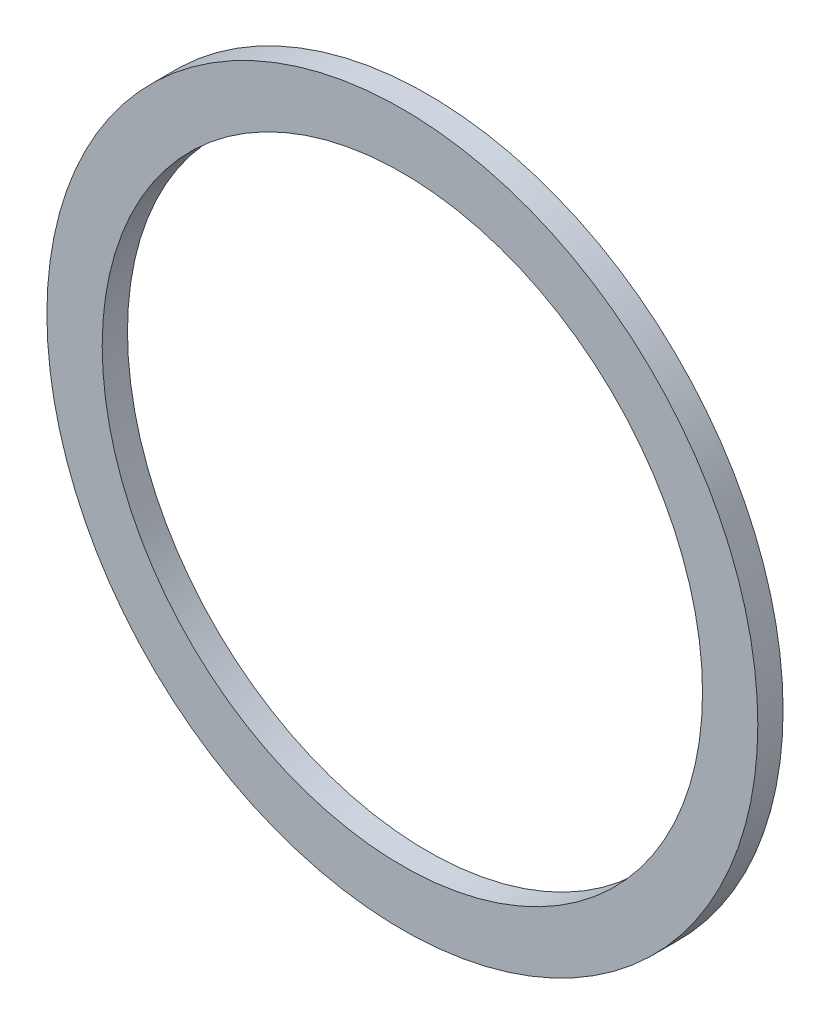
ISO-10303-21;
HEADER;
FILE_DESCRIPTION(('STEP AP214'),'2;1');
FILE_NAME('part.step','',(''),(''),'','','');
FILE_SCHEMA(('AUTOMOTIVE_DESIGN { 1 0 10303 214 1 1 1 1 }'));
ENDSEC;
DATA;
#1=APPLICATION_CONTEXT('core data for automotive mechanical design processes');
#2=APPLICATION_PROTOCOL_DEFINITION('international standard','automotive_design',2000,#1);
#3=PRODUCT_CONTEXT('',#1,'mechanical');
#4=PRODUCT('Part','Part','',(#3));
#5=PRODUCT_RELATED_PRODUCT_CATEGORY('part','',(#4));
#6=PRODUCT_DEFINITION_FORMATION('','',#4);
#7=PRODUCT_DEFINITION_CONTEXT('part definition',#1,'design');
#8=PRODUCT_DEFINITION('design','',#6,#7);
#9=PRODUCT_DEFINITION_SHAPE('','',#8);
#10=(LENGTH_UNIT() NAMED_UNIT(*) SI_UNIT(.MILLI.,.METRE.));
#11=(NAMED_UNIT(*) PLANE_ANGLE_UNIT() SI_UNIT($,.RADIAN.));
#12=(NAMED_UNIT(*) SI_UNIT($,.STERADIAN.) SOLID_ANGLE_UNIT());
#13=UNCERTAINTY_MEASURE_WITH_UNIT(LENGTH_MEASURE(1.E-05),#10,'distance_accuracy_value','');
#14=(GEOMETRIC_REPRESENTATION_CONTEXT(3) GLOBAL_UNCERTAINTY_ASSIGNED_CONTEXT((#13)) GLOBAL_UNIT_ASSIGNED_CONTEXT((#10,
#11,#12)) REPRESENTATION_CONTEXT('',''));
#15=CARTESIAN_POINT('',(0.,0.,0.));
#16=DIRECTION('',(0.,0.,1.));
#17=DIRECTION('',(1.,0.,0.));
#18=AXIS2_PLACEMENT_3D('',#15,#16,#17);
#19=CARTESIAN_POINT('',(0.,0.,0.800000000000023));
#20=DIRECTION('',(0.,0.,0.999999999999998));
#21=DIRECTION('',(0.999999999999999,0.,0.));
#22=AXIS2_PLACEMENT_3D('',#19,#20,#21);
#23=PLANE('',#22);
#24=CARTESIAN_POINT('',(0.,0.,0.800000000000023));
#25=DIRECTION('',(0.,0.,0.999999999999998));
#26=DIRECTION('',(0.999999999999999,0.,0.));
#27=AXIS2_PLACEMENT_3D('',#24,#25,#26);
#28=CIRCLE('',#27,19.);
#29=CARTESIAN_POINT('',(19.,0.,0.800000000000023));
#30=VERTEX_POINT('',#29);
#31=EDGE_CURVE('E22',#30,#30,#28,.T.);
#32=ORIENTED_EDGE('',*,*,#31,.F.);
#33=EDGE_LOOP('',(#32));
#34=FACE_BOUND('',#33,.T.);
#35=CARTESIAN_POINT('',(0.,0.,0.800000000000023));
#36=DIRECTION('',(0.,0.,0.999999999999998));
#37=DIRECTION('',(0.999999999999999,0.,0.));
#38=AXIS2_PLACEMENT_3D('',#35,#36,#37);
#39=CIRCLE('',#38,22.5);
#40=CARTESIAN_POINT('',(22.5,0.,0.800000000000023));
#41=VERTEX_POINT('',#40);
#42=EDGE_CURVE('E28',#41,#41,#39,.T.);
#43=ORIENTED_EDGE('',*,*,#42,.T.);
#44=EDGE_LOOP('',(#43));
#45=FACE_BOUND('',#44,.T.);
#46=ADVANCED_FACE('F15',(#34,#45),#23,.T.);
#47=CARTESIAN_POINT('',(0.,0.,-0.800000000000023));
#48=DIRECTION('',(0.,0.,0.999999999999998));
#49=DIRECTION('',(0.999999999999999,0.,0.));
#50=AXIS2_PLACEMENT_3D('',#47,#48,#49);
#51=PLANE('',#50);
#52=CARTESIAN_POINT('',(0.,0.,-0.800000000000023));
#53=DIRECTION('',(0.,0.,0.999999999999998));
#54=DIRECTION('',(0.999999999999999,0.,0.));
#55=AXIS2_PLACEMENT_3D('',#52,#53,#54);
#56=CIRCLE('',#55,19.);
#57=CARTESIAN_POINT('',(19.,0.,-0.800000000000023));
#58=VERTEX_POINT('',#57);
#59=EDGE_CURVE('E10',#58,#58,#56,.T.);
#60=ORIENTED_EDGE('',*,*,#59,.T.);
#61=EDGE_LOOP('',(#60));
#62=FACE_BOUND('',#61,.T.);
#63=CARTESIAN_POINT('',(0.,0.,-0.800000000000023));
#64=DIRECTION('',(0.,0.,0.999999999999998));
#65=DIRECTION('',(0.999999999999999,0.,0.));
#66=AXIS2_PLACEMENT_3D('',#63,#64,#65);
#67=CIRCLE('',#66,22.5);
#68=CARTESIAN_POINT('',(22.5,0.,-0.800000000000023));
#69=VERTEX_POINT('',#68);
#70=EDGE_CURVE('E38',#69,#69,#67,.T.);
#71=ORIENTED_EDGE('',*,*,#70,.F.);
#72=EDGE_LOOP('',(#71));
#73=FACE_BOUND('',#72,.T.);
#74=ADVANCED_FACE('F46',(#62,#73),#51,.F.);
#75=CARTESIAN_POINT('',(0.,0.,-0.800000000000023));
#76=DIRECTION('',(0.,0.,-0.999999999999998));
#77=DIRECTION('',(0.999999999999999,0.,0.));
#78=AXIS2_PLACEMENT_3D('',#75,#76,#77);
#79=CYLINDRICAL_SURFACE('',#78,19.);
#80=CARTESIAN_POINT('',(19.,0.,0.800000000000023));
#81=CARTESIAN_POINT('',(19.,0.,0.783333333333356));
#82=CARTESIAN_POINT('',(19.,0.,0.766666666666688));
#83=CARTESIAN_POINT('',(19.,0.,0.733333333333354));
#84=CARTESIAN_POINT('',(19.,0.,0.716666666666687));
#85=CARTESIAN_POINT('',(19.,0.,0.683333333333353));
#86=CARTESIAN_POINT('',(19.,0.,0.666666666666686));
#87=CARTESIAN_POINT('',(19.,0.,0.633333333333351));
#88=CARTESIAN_POINT('',(19.,0.,0.616666666666684));
#89=CARTESIAN_POINT('',(19.,0.,0.58333333333335));
#90=CARTESIAN_POINT('',(19.,0.,0.566666666666683));
#91=CARTESIAN_POINT('',(19.,0.,0.533333333333348));
#92=CARTESIAN_POINT('',(19.,0.,0.516666666666681));
#93=CARTESIAN_POINT('',(19.,0.,0.483333333333347));
#94=CARTESIAN_POINT('',(19.,0.,0.46666666666668));
#95=CARTESIAN_POINT('',(19.,0.,0.433333333333346));
#96=CARTESIAN_POINT('',(19.,0.,0.416666666666678));
#97=CARTESIAN_POINT('',(19.,0.,0.383333333333344));
#98=CARTESIAN_POINT('',(19.,0.,0.366666666666677));
#99=CARTESIAN_POINT('',(19.,0.,0.333333333333343));
#100=CARTESIAN_POINT('',(19.,0.,0.316666666666676));
#101=CARTESIAN_POINT('',(19.,0.,0.283333333333341));
#102=CARTESIAN_POINT('',(19.,0.,0.266666666666674));
#103=CARTESIAN_POINT('',(19.,0.,0.23333333333334));
#104=CARTESIAN_POINT('',(19.,0.,0.216666666666673));
#105=CARTESIAN_POINT('',(19.,0.,0.183333333333339));
#106=CARTESIAN_POINT('',(19.,0.,0.166666666666671));
#107=CARTESIAN_POINT('',(19.,0.,0.133333333333337));
#108=CARTESIAN_POINT('',(19.,0.,0.11666666666667));
#109=CARTESIAN_POINT('',(19.,0.,0.0833333333333356));
#110=CARTESIAN_POINT('',(19.,0.,0.0666666666666685));
#111=CARTESIAN_POINT('',(19.,0.,0.0333333333333342));
#112=CARTESIAN_POINT('',(19.,0.,0.016666666666667));
#113=CARTESIAN_POINT('',(19.,0.,-0.0166666666666672));
#114=CARTESIAN_POINT('',(19.,0.,-0.0333333333333344));
#115=CARTESIAN_POINT('',(19.,0.,-0.0666666666666687));
#116=CARTESIAN_POINT('',(19.,0.,-0.0833333333333358));
#117=CARTESIAN_POINT('',(19.,0.,-0.11666666666667));
#118=CARTESIAN_POINT('',(19.,0.,-0.133333333333337));
#119=CARTESIAN_POINT('',(19.,0.,-0.166666666666672));
#120=CARTESIAN_POINT('',(19.,0.,-0.183333333333339));
#121=CARTESIAN_POINT('',(19.,0.,-0.216666666666673));
#122=CARTESIAN_POINT('',(19.,0.,-0.23333333333334));
#123=CARTESIAN_POINT('',(19.,0.,-0.266666666666674));
#124=CARTESIAN_POINT('',(19.,0.,-0.283333333333341));
#125=CARTESIAN_POINT('',(19.,0.,-0.316666666666676));
#126=CARTESIAN_POINT('',(19.,0.,-0.333333333333343));
#127=CARTESIAN_POINT('',(19.,0.,-0.366666666666677));
#128=CARTESIAN_POINT('',(19.,0.,-0.383333333333344));
#129=CARTESIAN_POINT('',(19.,0.,-0.416666666666679));
#130=CARTESIAN_POINT('',(19.,0.,-0.433333333333346));
#131=CARTESIAN_POINT('',(19.,0.,-0.46666666666668));
#132=CARTESIAN_POINT('',(19.,0.,-0.483333333333347));
#133=CARTESIAN_POINT('',(19.,0.,-0.516666666666681));
#134=CARTESIAN_POINT('',(19.,0.,-0.533333333333349));
#135=CARTESIAN_POINT('',(19.,0.,-0.566666666666683));
#136=CARTESIAN_POINT('',(19.,0.,-0.58333333333335));
#137=CARTESIAN_POINT('',(19.,0.,-0.616666666666684));
#138=CARTESIAN_POINT('',(19.,0.,-0.633333333333351));
#139=CARTESIAN_POINT('',(19.,0.,-0.666666666666686));
#140=CARTESIAN_POINT('',(19.,0.,-0.683333333333353));
#141=CARTESIAN_POINT('',(19.,0.,-0.716666666666687));
#142=CARTESIAN_POINT('',(19.,0.,-0.733333333333354));
#143=CARTESIAN_POINT('',(19.,0.,-0.766666666666689));
#144=CARTESIAN_POINT('',(19.,0.,-0.783333333333356));
#145=CARTESIAN_POINT('',(19.,0.,-0.800000000000023));
#146=B_SPLINE_CURVE_WITH_KNOTS('',3,(#80,#81,#82,#83,#84,#85,#86,#87,#88,#89,#90,#91,#92,#93,
#94,#95,#96,#97,#98,#99,#100,#101,#102,#103,#104,#105,#106,#107,#108,#109,#110,#111,#112,#113,
#114,#115,#116,#117,#118,#119,#120,#121,#122,#123,#124,#125,#126,#127,#128,#129,#130,#131,#132,
#133,#134,#135,#136,#137,#138,#139,#140,#141,#142,#143,#144,#145),.UNSPECIFIED.,.F.,.F.,(4,2,2,
2,2,2,2,2,2,2,2,2,2,2,2,2,2,2,2,2,2,2,2,2,2,2,2,2,2,2,2,2,4),(0.,0.0500000000000014,
0.100000000000003,0.150000000000004,0.200000000000006,0.250000000000007,0.300000000000009,
0.35000000000001,0.400000000000011,0.450000000000013,0.500000000000014,0.550000000000016,
0.600000000000017,0.650000000000019,0.70000000000002,0.750000000000021,0.800000000000023,
0.850000000000024,0.900000000000026,0.950000000000027,1.00000000000003,1.05000000000003,
1.10000000000003,1.15000000000003,1.20000000000003,1.25000000000004,1.30000000000004,
1.35000000000004,1.40000000000004,1.45000000000004,1.50000000000004,1.55000000000004,
1.60000000000005),.UNSPECIFIED.);
#147=EDGE_CURVE('BSEAM48',#30,#58,#146,.T.);
#148=ORIENTED_EDGE('',*,*,#31,.T.);
#149=ORIENTED_EDGE('',*,*,#59,.F.);
#150=ORIENTED_EDGE('',*,*,#147,.T.);
#151=ORIENTED_EDGE('',*,*,#147,.F.);
#152=EDGE_LOOP('',(#148,#150,#149,#151));
#153=FACE_BOUND('',#152,.T.);
#154=ADVANCED_FACE('F48',(#153),#79,.F.);
#155=CARTESIAN_POINT('',(0.,0.,-0.800000000000023));
#156=DIRECTION('',(0.,0.,-0.999999999999998));
#157=DIRECTION('',(0.999999999999999,0.,0.));
#158=AXIS2_PLACEMENT_3D('',#155,#156,#157);
#159=CYLINDRICAL_SURFACE('',#158,22.5);
#160=CARTESIAN_POINT('',(22.5,0.,0.800000000000023));
#161=CARTESIAN_POINT('',(22.5,0.,0.783333333333356));
#162=CARTESIAN_POINT('',(22.5,0.,0.766666666666688));
#163=CARTESIAN_POINT('',(22.5,0.,0.733333333333354));
#164=CARTESIAN_POINT('',(22.5,0.,0.716666666666687));
#165=CARTESIAN_POINT('',(22.5,0.,0.683333333333353));
#166=CARTESIAN_POINT('',(22.5,0.,0.666666666666686));
#167=CARTESIAN_POINT('',(22.5,0.,0.633333333333351));
#168=CARTESIAN_POINT('',(22.5,0.,0.616666666666684));
#169=CARTESIAN_POINT('',(22.5,0.,0.58333333333335));
#170=CARTESIAN_POINT('',(22.5,0.,0.566666666666683));
#171=CARTESIAN_POINT('',(22.5,0.,0.533333333333348));
#172=CARTESIAN_POINT('',(22.5,0.,0.516666666666681));
#173=CARTESIAN_POINT('',(22.5,0.,0.483333333333347));
#174=CARTESIAN_POINT('',(22.5,0.,0.46666666666668));
#175=CARTESIAN_POINT('',(22.5,0.,0.433333333333346));
#176=CARTESIAN_POINT('',(22.5,0.,0.416666666666678));
#177=CARTESIAN_POINT('',(22.5,0.,0.383333333333344));
#178=CARTESIAN_POINT('',(22.5,0.,0.366666666666677));
#179=CARTESIAN_POINT('',(22.5,0.,0.333333333333343));
#180=CARTESIAN_POINT('',(22.5,0.,0.316666666666676));
#181=CARTESIAN_POINT('',(22.5,0.,0.283333333333341));
#182=CARTESIAN_POINT('',(22.5,0.,0.266666666666674));
#183=CARTESIAN_POINT('',(22.5,0.,0.23333333333334));
#184=CARTESIAN_POINT('',(22.5,0.,0.216666666666673));
#185=CARTESIAN_POINT('',(22.5,0.,0.183333333333339));
#186=CARTESIAN_POINT('',(22.5,0.,0.166666666666671));
#187=CARTESIAN_POINT('',(22.5,0.,0.133333333333337));
#188=CARTESIAN_POINT('',(22.5,0.,0.11666666666667));
#189=CARTESIAN_POINT('',(22.5,0.,0.0833333333333356));
#190=CARTESIAN_POINT('',(22.5,0.,0.0666666666666685));
#191=CARTESIAN_POINT('',(22.5,0.,0.0333333333333342));
#192=CARTESIAN_POINT('',(22.5,0.,0.016666666666667));
#193=CARTESIAN_POINT('',(22.5,0.,-0.0166666666666672));
#194=CARTESIAN_POINT('',(22.5,0.,-0.0333333333333344));
#195=CARTESIAN_POINT('',(22.5,0.,-0.0666666666666687));
#196=CARTESIAN_POINT('',(22.5,0.,-0.0833333333333358));
#197=CARTESIAN_POINT('',(22.5,0.,-0.11666666666667));
#198=CARTESIAN_POINT('',(22.5,0.,-0.133333333333337));
#199=CARTESIAN_POINT('',(22.5,0.,-0.166666666666672));
#200=CARTESIAN_POINT('',(22.5,0.,-0.183333333333339));
#201=CARTESIAN_POINT('',(22.5,0.,-0.216666666666673));
#202=CARTESIAN_POINT('',(22.5,0.,-0.23333333333334));
#203=CARTESIAN_POINT('',(22.5,0.,-0.266666666666674));
#204=CARTESIAN_POINT('',(22.5,0.,-0.283333333333341));
#205=CARTESIAN_POINT('',(22.5,0.,-0.316666666666676));
#206=CARTESIAN_POINT('',(22.5,0.,-0.333333333333343));
#207=CARTESIAN_POINT('',(22.5,0.,-0.366666666666677));
#208=CARTESIAN_POINT('',(22.5,0.,-0.383333333333344));
#209=CARTESIAN_POINT('',(22.5,0.,-0.416666666666679));
#210=CARTESIAN_POINT('',(22.5,0.,-0.433333333333346));
#211=CARTESIAN_POINT('',(22.5,0.,-0.46666666666668));
#212=CARTESIAN_POINT('',(22.5,0.,-0.483333333333347));
#213=CARTESIAN_POINT('',(22.5,0.,-0.516666666666681));
#214=CARTESIAN_POINT('',(22.5,0.,-0.533333333333349));
#215=CARTESIAN_POINT('',(22.5,0.,-0.566666666666683));
#216=CARTESIAN_POINT('',(22.5,0.,-0.58333333333335));
#217=CARTESIAN_POINT('',(22.5,0.,-0.616666666666684));
#218=CARTESIAN_POINT('',(22.5,0.,-0.633333333333351));
#219=CARTESIAN_POINT('',(22.5,0.,-0.666666666666686));
#220=CARTESIAN_POINT('',(22.5,0.,-0.683333333333353));
#221=CARTESIAN_POINT('',(22.5,0.,-0.716666666666687));
#222=CARTESIAN_POINT('',(22.5,0.,-0.733333333333354));
#223=CARTESIAN_POINT('',(22.5,0.,-0.766666666666689));
#224=CARTESIAN_POINT('',(22.5,0.,-0.783333333333356));
#225=CARTESIAN_POINT('',(22.5,0.,-0.800000000000023));
#226=B_SPLINE_CURVE_WITH_KNOTS('',3,(#160,#161,#162,#163,#164,#165,#166,#167,#168,#169,#170,
#171,#172,#173,#174,#175,#176,#177,#178,#179,#180,#181,#182,#183,#184,#185,#186,#187,#188,#189,
#190,#191,#192,#193,#194,#195,#196,#197,#198,#199,#200,#201,#202,#203,#204,#205,#206,#207,#208,
#209,#210,#211,#212,#213,#214,#215,#216,#217,#218,#219,#220,#221,#222,#223,#224,#225),
.UNSPECIFIED.,.F.,.F.,(4,2,2,2,2,2,2,2,2,2,2,2,2,2,2,2,2,2,2,2,2,2,2,2,2,2,2,2,2,2,2,2,4),(0.,
0.0500000000000014,0.100000000000003,0.150000000000004,0.200000000000006,0.250000000000007,
0.300000000000009,0.35000000000001,0.400000000000011,0.450000000000013,0.500000000000014,
0.550000000000016,0.600000000000017,0.650000000000019,0.70000000000002,0.750000000000021,
0.800000000000023,0.850000000000024,0.900000000000026,0.950000000000027,1.00000000000003,
1.05000000000003,1.10000000000003,1.15000000000003,1.20000000000003,1.25000000000004,
1.30000000000004,1.35000000000004,1.40000000000004,1.45000000000004,1.50000000000004,
1.55000000000004,1.60000000000005),.UNSPECIFIED.);
#227=EDGE_CURVE('BSEAM42',#41,#69,#226,.T.);
#228=ORIENTED_EDGE('',*,*,#42,.F.);
#229=ORIENTED_EDGE('',*,*,#70,.T.);
#230=ORIENTED_EDGE('',*,*,#227,.T.);
#231=ORIENTED_EDGE('',*,*,#227,.F.);
#232=EDGE_LOOP('',(#228,#230,#229,#231));
#233=FACE_BOUND('',#232,.T.);
#234=ADVANCED_FACE('F42',(#233),#159,.T.);
#235=CLOSED_SHELL('',(#46,#74,#154,#234));
#236=MANIFOLD_SOLID_BREP('B1',#235);
#237=ADVANCED_BREP_SHAPE_REPRESENTATION('',(#18,#236),#14);
#238=SHAPE_DEFINITION_REPRESENTATION(#9,#237);
ENDSEC;
END-ISO-10303-21;
